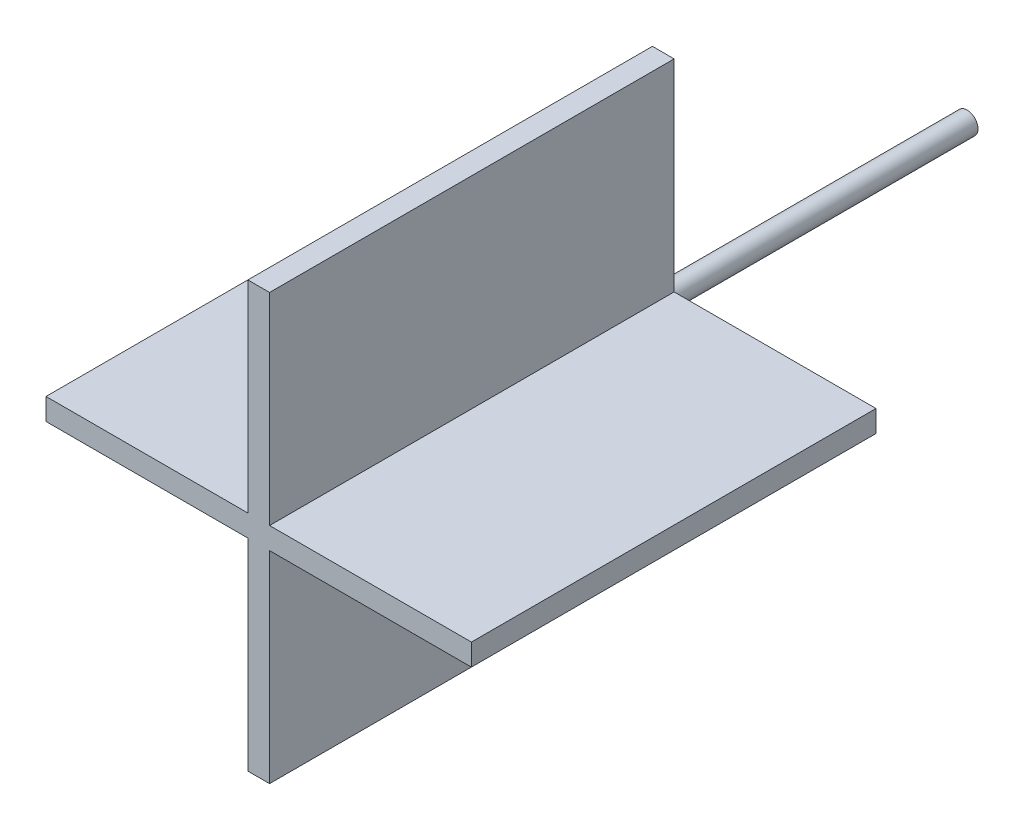
ISO-10303-21;
HEADER;
FILE_DESCRIPTION(('STEP AP214'),'2;1');
FILE_NAME('part.step','',(''),(''),'','','');
FILE_SCHEMA(('AUTOMOTIVE_DESIGN { 1 0 10303 214 1 1 1 1 }'));
ENDSEC;
DATA;
#1=APPLICATION_CONTEXT('core data for automotive mechanical design processes');
#2=APPLICATION_PROTOCOL_DEFINITION('international standard','automotive_design',2000,#1);
#3=PRODUCT_CONTEXT('',#1,'mechanical');
#4=PRODUCT('Part','Part','',(#3));
#5=PRODUCT_RELATED_PRODUCT_CATEGORY('part','',(#4));
#6=PRODUCT_DEFINITION_FORMATION('','',#4);
#7=PRODUCT_DEFINITION_CONTEXT('part definition',#1,'design');
#8=PRODUCT_DEFINITION('design','',#6,#7);
#9=PRODUCT_DEFINITION_SHAPE('','',#8);
#10=(LENGTH_UNIT() NAMED_UNIT(*) SI_UNIT(.MILLI.,.METRE.));
#11=(NAMED_UNIT(*) PLANE_ANGLE_UNIT() SI_UNIT($,.RADIAN.));
#12=(NAMED_UNIT(*) SI_UNIT($,.STERADIAN.) SOLID_ANGLE_UNIT());
#13=UNCERTAINTY_MEASURE_WITH_UNIT(LENGTH_MEASURE(1.E-05),#10,'distance_accuracy_value','');
#14=(GEOMETRIC_REPRESENTATION_CONTEXT(3) GLOBAL_UNCERTAINTY_ASSIGNED_CONTEXT((#13)) GLOBAL_UNIT_ASSIGNED_CONTEXT((#10,
#11,#12)) REPRESENTATION_CONTEXT('',''));
#15=CARTESIAN_POINT('',(0.,0.,0.));
#16=DIRECTION('',(0.,0.,1.));
#17=DIRECTION('',(1.,0.,0.));
#18=AXIS2_PLACEMENT_3D('',#15,#16,#17);
#19=CARTESIAN_POINT('',(0.,-46.5,93.2));
#20=DIRECTION('',(1.,0.,0.));
#21=DIRECTION('',(0.,1.,0.));
#22=AXIS2_PLACEMENT_3D('',#19,#20,#21);
#23=PLANE('',#22);
#24=DIRECTION('',(0.,-1.,0.));
#25=VECTOR('',#24,1.);
#26=CARTESIAN_POINT('',(0.,-46.5,0.));
#27=LINE('',#26,#25);
#28=CARTESIAN_POINT('',(0.,0.,0.));
#29=VERTEX_POINT('',#28);
#30=CARTESIAN_POINT('',(0.,-46.5,0.));
#31=VERTEX_POINT('',#30);
#32=EDGE_CURVE('E159',#29,#31,#27,.T.);
#33=ORIENTED_EDGE('',*,*,#32,.T.);
#34=DIRECTION('',(0.,0.,-1.));
#35=VECTOR('',#34,1.);
#36=CARTESIAN_POINT('',(0.,-46.5,93.2));
#37=LINE('',#36,#35);
#38=CARTESIAN_POINT('',(0.,-46.5,93.2));
#39=VERTEX_POINT('',#38);
#40=EDGE_CURVE('E11',#39,#31,#37,.T.);
#41=ORIENTED_EDGE('',*,*,#40,.F.);
#42=DIRECTION('',(0.,-1.,0.));
#43=VECTOR('',#42,1.);
#44=CARTESIAN_POINT('',(0.,-46.5,93.2));
#45=LINE('',#44,#43);
#46=CARTESIAN_POINT('',(0.,0.,93.2));
#47=VERTEX_POINT('',#46);
#48=EDGE_CURVE('E182',#47,#39,#45,.T.);
#49=ORIENTED_EDGE('',*,*,#48,.F.);
#50=DIRECTION('',(0.,0.,-1.));
#51=VECTOR('',#50,1.);
#52=CARTESIAN_POINT('',(0.,0.,93.2));
#53=LINE('',#52,#51);
#54=EDGE_CURVE('E155',#47,#29,#53,.T.);
#55=ORIENTED_EDGE('',*,*,#54,.T.);
#56=EDGE_LOOP('',(#33,#41,#49,#55));
#57=FACE_BOUND('',#56,.T.);
#58=ADVANCED_FACE('F39',(#57),#23,.F.);
#59=CARTESIAN_POINT('',(5.00000000000001,-46.5,93.2));
#60=DIRECTION('',(0.,1.,0.));
#61=DIRECTION('',(0.,0.,1.));
#62=AXIS2_PLACEMENT_3D('',#59,#60,#61);
#63=PLANE('',#62);
#64=DIRECTION('',(1.,0.,0.));
#65=VECTOR('',#64,1.);
#66=CARTESIAN_POINT('',(5.00000000000001,-46.5,0.));
#67=LINE('',#66,#65);
#68=CARTESIAN_POINT('',(5.00000000000001,-46.5,0.));
#69=VERTEX_POINT('',#68);
#70=EDGE_CURVE('E162',#31,#69,#67,.T.);
#71=ORIENTED_EDGE('',*,*,#70,.T.);
#72=DIRECTION('',(0.,0.,-1.));
#73=VECTOR('',#72,1.);
#74=CARTESIAN_POINT('',(5.00000000000001,-46.5,93.2));
#75=LINE('',#74,#73);
#76=CARTESIAN_POINT('',(5.00000000000001,-46.5,93.2));
#77=VERTEX_POINT('',#76);
#78=EDGE_CURVE('E47',#77,#69,#75,.T.);
#79=ORIENTED_EDGE('',*,*,#78,.F.);
#80=DIRECTION('',(1.,0.,0.));
#81=VECTOR('',#80,1.);
#82=CARTESIAN_POINT('',(5.00000000000001,-46.5,93.2));
#83=LINE('',#82,#81);
#84=EDGE_CURVE('E110',#39,#77,#83,.T.);
#85=ORIENTED_EDGE('',*,*,#84,.F.);
#86=ORIENTED_EDGE('',*,*,#40,.T.);
#87=EDGE_LOOP('',(#71,#79,#85,#86));
#88=FACE_BOUND('',#87,.T.);
#89=ADVANCED_FACE('F260',(#88),#63,.F.);
#90=CARTESIAN_POINT('',(4.99999999999988,-2.22044604925031E-13,93.2));
#91=DIRECTION('',(-1.,0.,0.));
#92=DIRECTION('',(0.,-1.,0.));
#93=AXIS2_PLACEMENT_3D('',#90,#91,#92);
#94=PLANE('',#93);
#95=DIRECTION('',(0.,1.,0.));
#96=VECTOR('',#95,1.);
#97=CARTESIAN_POINT('',(4.99999999999988,-2.22044604925031E-13,0.));
#98=LINE('',#97,#96);
#99=CARTESIAN_POINT('',(4.99999999999988,-2.22044604925031E-13,0.));
#100=VERTEX_POINT('',#99);
#101=EDGE_CURVE('E165',#69,#100,#98,.T.);
#102=ORIENTED_EDGE('',*,*,#101,.T.);
#103=DIRECTION('',(0.,0.,-1.));
#104=VECTOR('',#103,1.);
#105=CARTESIAN_POINT('',(4.99999999999988,-2.22044604925031E-13,93.2));
#106=LINE('',#105,#104);
#107=CARTESIAN_POINT('',(4.99999999999988,-2.22044604925031E-13,93.2));
#108=VERTEX_POINT('',#107);
#109=EDGE_CURVE('E201',#108,#100,#106,.T.);
#110=ORIENTED_EDGE('',*,*,#109,.F.);
#111=DIRECTION('',(0.,1.,0.));
#112=VECTOR('',#111,1.);
#113=CARTESIAN_POINT('',(4.99999999999988,-2.22044604925031E-13,93.2));
#114=LINE('',#113,#112);
#115=EDGE_CURVE('E209',#77,#108,#114,.T.);
#116=ORIENTED_EDGE('',*,*,#115,.F.);
#117=ORIENTED_EDGE('',*,*,#78,.T.);
#118=EDGE_LOOP('',(#102,#110,#116,#117));
#119=FACE_BOUND('',#118,.T.);
#120=ADVANCED_FACE('F207',(#119),#94,.F.);
#121=CARTESIAN_POINT('',(51.4999999999999,-2.16349997308996E-13,93.2));
#122=DIRECTION('',(0.,1.,0.));
#123=DIRECTION('',(-1.,0.,0.));
#124=AXIS2_PLACEMENT_3D('',#121,#122,#123);
#125=PLANE('',#124);
#126=DIRECTION('',(1.,0.,0.));
#127=VECTOR('',#126,1.);
#128=CARTESIAN_POINT('',(51.4999999999999,-2.16349997308996E-13,0.));
#129=LINE('',#128,#127);
#130=CARTESIAN_POINT('',(51.4999999999999,-2.16349997308996E-13,0.));
#131=VERTEX_POINT('',#130);
#132=EDGE_CURVE('E167',#100,#131,#129,.T.);
#133=ORIENTED_EDGE('',*,*,#132,.T.);
#134=DIRECTION('',(0.,0.,-1.));
#135=VECTOR('',#134,1.);
#136=CARTESIAN_POINT('',(51.4999999999999,-2.16349997308996E-13,93.2));
#137=LINE('',#136,#135);
#138=CARTESIAN_POINT('',(51.4999999999999,-2.16349997308996E-13,93.2));
#139=VERTEX_POINT('',#138);
#140=EDGE_CURVE('E198',#139,#131,#137,.T.);
#141=ORIENTED_EDGE('',*,*,#140,.F.);
#142=DIRECTION('',(1.,0.,0.));
#143=VECTOR('',#142,1.);
#144=CARTESIAN_POINT('',(51.4999999999999,-2.16349997308996E-13,93.2));
#145=LINE('',#144,#143);
#146=EDGE_CURVE('E227',#108,#139,#145,.T.);
#147=ORIENTED_EDGE('',*,*,#146,.F.);
#148=ORIENTED_EDGE('',*,*,#109,.T.);
#149=EDGE_LOOP('',(#133,#141,#147,#148));
#150=FACE_BOUND('',#149,.T.);
#151=ADVANCED_FACE('F218',(#150),#125,.F.);
#152=CARTESIAN_POINT('',(51.4999999999999,4.99999999999978,93.2));
#153=DIRECTION('',(-1.,0.,0.));
#154=DIRECTION('',(0.,0.,1.));
#155=AXIS2_PLACEMENT_3D('',#152,#153,#154);
#156=PLANE('',#155);
#157=DIRECTION('',(0.,1.,0.));
#158=VECTOR('',#157,1.);
#159=CARTESIAN_POINT('',(51.4999999999999,4.99999999999978,0.));
#160=LINE('',#159,#158);
#161=CARTESIAN_POINT('',(51.4999999999999,4.99999999999978,0.));
#162=VERTEX_POINT('',#161);
#163=EDGE_CURVE('E169',#131,#162,#160,.T.);
#164=ORIENTED_EDGE('',*,*,#163,.T.);
#165=DIRECTION('',(0.,0.,-1.));
#166=VECTOR('',#165,1.);
#167=CARTESIAN_POINT('',(51.4999999999999,4.99999999999978,93.2));
#168=LINE('',#167,#166);
#169=CARTESIAN_POINT('',(51.4999999999999,4.99999999999978,93.2));
#170=VERTEX_POINT('',#169);
#171=EDGE_CURVE('E195',#170,#162,#168,.T.);
#172=ORIENTED_EDGE('',*,*,#171,.F.);
#173=DIRECTION('',(0.,1.,0.));
#174=VECTOR('',#173,1.);
#175=CARTESIAN_POINT('',(51.4999999999999,4.99999999999978,93.2));
#176=LINE('',#175,#174);
#177=EDGE_CURVE('E224',#139,#170,#176,.T.);
#178=ORIENTED_EDGE('',*,*,#177,.F.);
#179=ORIENTED_EDGE('',*,*,#140,.T.);
#180=EDGE_LOOP('',(#164,#172,#178,#179));
#181=FACE_BOUND('',#180,.T.);
#182=ADVANCED_FACE('F222',(#181),#156,.F.);
#183=CARTESIAN_POINT('',(5.00000000000002,4.99999999999992,93.2));
#184=DIRECTION('',(0.,-1.,0.));
#185=DIRECTION('',(1.,0.,0.));
#186=AXIS2_PLACEMENT_3D('',#183,#184,#185);
#187=PLANE('',#186);
#188=DIRECTION('',(-1.,0.,0.));
#189=VECTOR('',#188,1.);
#190=CARTESIAN_POINT('',(5.00000000000002,4.99999999999992,0.));
#191=LINE('',#190,#189);
#192=CARTESIAN_POINT('',(5.00000000000002,4.99999999999992,0.));
#193=VERTEX_POINT('',#192);
#194=EDGE_CURVE('E171',#162,#193,#191,.T.);
#195=ORIENTED_EDGE('',*,*,#194,.T.);
#196=DIRECTION('',(0.,0.,-1.));
#197=VECTOR('',#196,1.);
#198=CARTESIAN_POINT('',(5.00000000000002,4.99999999999992,93.2));
#199=LINE('',#198,#197);
#200=CARTESIAN_POINT('',(5.00000000000002,4.99999999999992,93.2));
#201=VERTEX_POINT('',#200);
#202=EDGE_CURVE('E192',#201,#193,#199,.T.);
#203=ORIENTED_EDGE('',*,*,#202,.F.);
#204=DIRECTION('',(-1.,0.,0.));
#205=VECTOR('',#204,1.);
#206=CARTESIAN_POINT('',(5.00000000000002,4.99999999999992,93.2));
#207=LINE('',#206,#205);
#208=EDGE_CURVE('E226',#170,#201,#207,.T.);
#209=ORIENTED_EDGE('',*,*,#208,.F.);
#210=ORIENTED_EDGE('',*,*,#171,.T.);
#211=EDGE_LOOP('',(#195,#203,#209,#210));
#212=FACE_BOUND('',#211,.T.);
#213=ADVANCED_FACE('F273',(#212),#187,.F.);
#214=CARTESIAN_POINT('',(5.,51.4999999999999,93.2));
#215=DIRECTION('',(-1.,0.,0.));
#216=DIRECTION('',(0.,-1.,0.));
#217=AXIS2_PLACEMENT_3D('',#214,#215,#216);
#218=PLANE('',#217);
#219=DIRECTION('',(0.,1.,0.));
#220=VECTOR('',#219,1.);
#221=CARTESIAN_POINT('',(5.,51.4999999999999,0.));
#222=LINE('',#221,#220);
#223=CARTESIAN_POINT('',(5.,51.4999999999999,0.));
#224=VERTEX_POINT('',#223);
#225=EDGE_CURVE('E173',#193,#224,#222,.T.);
#226=ORIENTED_EDGE('',*,*,#225,.T.);
#227=DIRECTION('',(0.,0.,-1.));
#228=VECTOR('',#227,1.);
#229=CARTESIAN_POINT('',(5.,51.4999999999999,93.2));
#230=LINE('',#229,#228);
#231=CARTESIAN_POINT('',(5.,51.4999999999999,93.2));
#232=VERTEX_POINT('',#231);
#233=EDGE_CURVE('E189',#232,#224,#230,.T.);
#234=ORIENTED_EDGE('',*,*,#233,.F.);
#235=DIRECTION('',(0.,1.,0.));
#236=VECTOR('',#235,1.);
#237=CARTESIAN_POINT('',(5.,51.4999999999999,93.2));
#238=LINE('',#237,#236);
#239=EDGE_CURVE('E229',#201,#232,#238,.T.);
#240=ORIENTED_EDGE('',*,*,#239,.F.);
#241=ORIENTED_EDGE('',*,*,#202,.T.);
#242=EDGE_LOOP('',(#226,#234,#240,#241));
#243=FACE_BOUND('',#242,.T.);
#244=ADVANCED_FACE('F276',(#243),#218,.F.);
#245=CARTESIAN_POINT('',(0.,51.4999999999999,93.2));
#246=DIRECTION('',(0.,-1.,0.));
#247=DIRECTION('',(0.,0.,-1.));
#248=AXIS2_PLACEMENT_3D('',#245,#246,#247);
#249=PLANE('',#248);
#250=DIRECTION('',(-1.,0.,0.));
#251=VECTOR('',#250,1.);
#252=CARTESIAN_POINT('',(0.,51.4999999999999,0.));
#253=LINE('',#252,#251);
#254=CARTESIAN_POINT('',(0.,51.4999999999999,0.));
#255=VERTEX_POINT('',#254);
#256=EDGE_CURVE('E175',#224,#255,#253,.T.);
#257=ORIENTED_EDGE('',*,*,#256,.T.);
#258=DIRECTION('',(0.,0.,-1.));
#259=VECTOR('',#258,1.);
#260=CARTESIAN_POINT('',(0.,51.4999999999999,93.2));
#261=LINE('',#260,#259);
#262=CARTESIAN_POINT('',(0.,51.4999999999999,93.2));
#263=VERTEX_POINT('',#262);
#264=EDGE_CURVE('E186',#263,#255,#261,.T.);
#265=ORIENTED_EDGE('',*,*,#264,.F.);
#266=DIRECTION('',(-1.,0.,0.));
#267=VECTOR('',#266,1.);
#268=CARTESIAN_POINT('',(0.,51.4999999999999,93.2));
#269=LINE('',#268,#267);
#270=EDGE_CURVE('E235',#232,#263,#269,.T.);
#271=ORIENTED_EDGE('',*,*,#270,.F.);
#272=ORIENTED_EDGE('',*,*,#233,.T.);
#273=EDGE_LOOP('',(#257,#265,#271,#272));
#274=FACE_BOUND('',#273,.T.);
#275=ADVANCED_FACE('F241',(#274),#249,.F.);
#276=CARTESIAN_POINT('',(0.,4.99999999999999,93.2));
#277=DIRECTION('',(1.,0.,0.));
#278=DIRECTION('',(0.,1.,0.));
#279=AXIS2_PLACEMENT_3D('',#276,#277,#278);
#280=PLANE('',#279);
#281=DIRECTION('',(0.,-1.,0.));
#282=VECTOR('',#281,1.);
#283=CARTESIAN_POINT('',(0.,4.99999999999999,0.));
#284=LINE('',#283,#282);
#285=CARTESIAN_POINT('',(0.,4.99999999999999,0.));
#286=VERTEX_POINT('',#285);
#287=EDGE_CURVE('E177',#255,#286,#284,.T.);
#288=ORIENTED_EDGE('',*,*,#287,.T.);
#289=DIRECTION('',(0.,0.,-1.));
#290=VECTOR('',#289,1.);
#291=CARTESIAN_POINT('',(0.,4.99999999999999,93.2));
#292=LINE('',#291,#290);
#293=CARTESIAN_POINT('',(0.,4.99999999999999,93.2));
#294=VERTEX_POINT('',#293);
#295=EDGE_CURVE('E150',#294,#286,#292,.T.);
#296=ORIENTED_EDGE('',*,*,#295,.F.);
#297=DIRECTION('',(0.,-1.,0.));
#298=VECTOR('',#297,1.);
#299=CARTESIAN_POINT('',(0.,4.99999999999999,93.2));
#300=LINE('',#299,#298);
#301=EDGE_CURVE('E141',#263,#294,#300,.T.);
#302=ORIENTED_EDGE('',*,*,#301,.F.);
#303=ORIENTED_EDGE('',*,*,#264,.T.);
#304=EDGE_LOOP('',(#288,#296,#302,#303));
#305=FACE_BOUND('',#304,.T.);
#306=ADVANCED_FACE('F245',(#305),#280,.F.);
#307=CARTESIAN_POINT('',(-46.5,4.99999999999999,93.2));
#308=DIRECTION('',(0.,-1.,0.));
#309=DIRECTION('',(0.,0.,-1.));
#310=AXIS2_PLACEMENT_3D('',#307,#308,#309);
#311=PLANE('',#310);
#312=DIRECTION('',(-1.,0.,0.));
#313=VECTOR('',#312,1.);
#314=CARTESIAN_POINT('',(-46.5,4.99999999999999,0.));
#315=LINE('',#314,#313);
#316=CARTESIAN_POINT('',(-46.5,4.99999999999999,0.));
#317=VERTEX_POINT('',#316);
#318=EDGE_CURVE('E149',#286,#317,#315,.T.);
#319=ORIENTED_EDGE('',*,*,#318,.T.);
#320=DIRECTION('',(0.,0.,-1.));
#321=VECTOR('',#320,1.);
#322=CARTESIAN_POINT('',(-46.5,4.99999999999999,93.2));
#323=LINE('',#322,#321);
#324=CARTESIAN_POINT('',(-46.5,4.99999999999999,93.2));
#325=VERTEX_POINT('',#324);
#326=EDGE_CURVE('E146',#325,#317,#323,.T.);
#327=ORIENTED_EDGE('',*,*,#326,.F.);
#328=DIRECTION('',(-1.,0.,0.));
#329=VECTOR('',#328,1.);
#330=CARTESIAN_POINT('',(-46.5,4.99999999999999,93.2));
#331=LINE('',#330,#329);
#332=EDGE_CURVE('E135',#294,#325,#331,.T.);
#333=ORIENTED_EDGE('',*,*,#332,.F.);
#334=ORIENTED_EDGE('',*,*,#295,.T.);
#335=EDGE_LOOP('',(#319,#327,#333,#334));
#336=FACE_BOUND('',#335,.T.);
#337=ADVANCED_FACE('F147',(#336),#311,.F.);
#338=CARTESIAN_POINT('',(-46.5,0.,93.2));
#339=DIRECTION('',(1.,0.,0.));
#340=DIRECTION('',(0.,1.,0.));
#341=AXIS2_PLACEMENT_3D('',#338,#339,#340);
#342=PLANE('',#341);
#343=DIRECTION('',(0.,-1.,0.));
#344=VECTOR('',#343,1.);
#345=CARTESIAN_POINT('',(-46.5,0.,0.));
#346=LINE('',#345,#344);
#347=CARTESIAN_POINT('',(-46.5,0.,0.));
#348=VERTEX_POINT('',#347);
#349=EDGE_CURVE('E96',#317,#348,#346,.T.);
#350=ORIENTED_EDGE('',*,*,#349,.T.);
#351=DIRECTION('',(0.,0.,-1.));
#352=VECTOR('',#351,1.);
#353=CARTESIAN_POINT('',(-46.5,0.,93.2));
#354=LINE('',#353,#352);
#355=CARTESIAN_POINT('',(-46.5,0.,93.2));
#356=VERTEX_POINT('',#355);
#357=EDGE_CURVE('E151',#356,#348,#354,.T.);
#358=ORIENTED_EDGE('',*,*,#357,.F.);
#359=DIRECTION('',(0.,-1.,0.));
#360=VECTOR('',#359,1.);
#361=CARTESIAN_POINT('',(-46.5,0.,93.2));
#362=LINE('',#361,#360);
#363=EDGE_CURVE('E139',#325,#356,#362,.T.);
#364=ORIENTED_EDGE('',*,*,#363,.F.);
#365=ORIENTED_EDGE('',*,*,#326,.T.);
#366=EDGE_LOOP('',(#350,#358,#364,#365));
#367=FACE_BOUND('',#366,.T.);
#368=ADVANCED_FACE('F153',(#367),#342,.F.);
#369=CARTESIAN_POINT('',(0.,0.,93.2));
#370=DIRECTION('',(0.,1.,0.));
#371=DIRECTION('',(-1.,0.,0.));
#372=AXIS2_PLACEMENT_3D('',#369,#370,#371);
#373=PLANE('',#372);
#374=DIRECTION('',(1.,0.,0.));
#375=VECTOR('',#374,1.);
#376=CARTESIAN_POINT('',(0.,0.,0.));
#377=LINE('',#376,#375);
#378=EDGE_CURVE('E102',#348,#29,#377,.T.);
#379=ORIENTED_EDGE('',*,*,#378,.T.);
#380=ORIENTED_EDGE('',*,*,#54,.F.);
#381=DIRECTION('',(1.,0.,0.));
#382=VECTOR('',#381,1.);
#383=CARTESIAN_POINT('',(0.,0.,93.2));
#384=LINE('',#383,#382);
#385=EDGE_CURVE('E55',#356,#47,#384,.T.);
#386=ORIENTED_EDGE('',*,*,#385,.F.);
#387=ORIENTED_EDGE('',*,*,#357,.T.);
#388=EDGE_LOOP('',(#379,#380,#386,#387));
#389=FACE_BOUND('',#388,.T.);
#390=ADVANCED_FACE('F249',(#389),#373,.F.);
#391=CARTESIAN_POINT('',(0.,0.,93.2));
#392=DIRECTION('',(0.,0.,1.));
#393=DIRECTION('',(1.,0.,0.));
#394=AXIS2_PLACEMENT_3D('',#391,#392,#393);
#395=PLANE('',#394);
#396=ORIENTED_EDGE('',*,*,#48,.T.);
#397=ORIENTED_EDGE('',*,*,#84,.T.);
#398=ORIENTED_EDGE('',*,*,#115,.T.);
#399=ORIENTED_EDGE('',*,*,#146,.T.);
#400=ORIENTED_EDGE('',*,*,#177,.T.);
#401=ORIENTED_EDGE('',*,*,#208,.T.);
#402=ORIENTED_EDGE('',*,*,#239,.T.);
#403=ORIENTED_EDGE('',*,*,#270,.T.);
#404=ORIENTED_EDGE('',*,*,#301,.T.);
#405=ORIENTED_EDGE('',*,*,#332,.T.);
#406=ORIENTED_EDGE('',*,*,#363,.T.);
#407=ORIENTED_EDGE('',*,*,#385,.T.);
#408=EDGE_LOOP('',(#396,#397,#398,#399,#400,#401,#402,#403,#404,#405,#406,#407));
#409=FACE_BOUND('',#408,.T.);
#410=ADVANCED_FACE('F137',(#409),#395,.T.);
#411=CARTESIAN_POINT('',(0.,0.,0.));
#412=DIRECTION('',(0.,0.,1.));
#413=DIRECTION('',(1.,0.,0.));
#414=AXIS2_PLACEMENT_3D('',#411,#412,#413);
#415=PLANE('',#414);
#416=CARTESIAN_POINT('',(2.5,2.53696306111983,0.));
#417=DIRECTION('',(0.,0.,1.));
#418=DIRECTION('',(1.,0.,0.));
#419=AXIS2_PLACEMENT_3D('',#416,#417,#418);
#420=CIRCLE('',#419,2.5);
#421=CARTESIAN_POINT('',(5.00000000000001,2.53696306111983,0.));
#422=VERTEX_POINT('',#421);
#423=EDGE_CURVE('E339',#422,#422,#420,.T.);
#424=ORIENTED_EDGE('',*,*,#423,.T.);
#425=EDGE_LOOP('',(#424));
#426=FACE_BOUND('',#425,.T.);
#427=ORIENTED_EDGE('',*,*,#32,.F.);
#428=ORIENTED_EDGE('',*,*,#378,.F.);
#429=ORIENTED_EDGE('',*,*,#349,.F.);
#430=ORIENTED_EDGE('',*,*,#318,.F.);
#431=ORIENTED_EDGE('',*,*,#287,.F.);
#432=ORIENTED_EDGE('',*,*,#256,.F.);
#433=ORIENTED_EDGE('',*,*,#225,.F.);
#434=ORIENTED_EDGE('',*,*,#194,.F.);
#435=ORIENTED_EDGE('',*,*,#163,.F.);
#436=ORIENTED_EDGE('',*,*,#132,.F.);
#437=ORIENTED_EDGE('',*,*,#101,.F.);
#438=ORIENTED_EDGE('',*,*,#70,.F.);
#439=EDGE_LOOP('',(#427,#428,#429,#430,#431,#432,#433,#434,#435,#436,#437,#438));
#440=FACE_BOUND('',#439,.T.);
#441=ADVANCED_FACE('F213',(#426,#440),#415,.F.);
#442=CARTESIAN_POINT('',(2.5,2.53696306111983,-70.));
#443=DIRECTION('',(0.,0.,1.));
#444=DIRECTION('',(1.,0.,0.));
#445=AXIS2_PLACEMENT_3D('',#442,#443,#444);
#446=CYLINDRICAL_SURFACE('',#445,2.5);
#447=CARTESIAN_POINT('',(2.5,2.53696306111983,-70.));
#448=DIRECTION('',(0.,0.,1.));
#449=DIRECTION('',(1.,0.,0.));
#450=AXIS2_PLACEMENT_3D('',#447,#448,#449);
#451=CIRCLE('',#450,2.5);
#452=CARTESIAN_POINT('',(5.00000000000001,2.53696306111983,-70.));
#453=VERTEX_POINT('',#452);
#454=EDGE_CURVE('E163',#453,#453,#451,.T.);
#455=ORIENTED_EDGE('',*,*,#454,.T.);
#456=EDGE_LOOP('',(#455));
#457=FACE_BOUND('',#456,.T.);
#458=ORIENTED_EDGE('',*,*,#423,.F.);
#459=EDGE_LOOP('',(#458));
#460=FACE_BOUND('',#459,.T.);
#461=ADVANCED_FACE('F315',(#457,#460),#446,.T.);
#462=CARTESIAN_POINT('',(2.5,2.53696306111983,-70.));
#463=DIRECTION('',(0.,0.,1.));
#464=DIRECTION('',(1.,0.,0.));
#465=AXIS2_PLACEMENT_3D('',#462,#463,#464);
#466=PLANE('',#465);
#467=ORIENTED_EDGE('',*,*,#454,.F.);
#468=EDGE_LOOP('',(#467));
#469=FACE_BOUND('',#468,.T.);
#470=ADVANCED_FACE('F324',(#469),#466,.F.);
#471=CLOSED_SHELL('',(#58,#89,#120,#151,#182,#213,#244,#275,#306,#337,#368,#390,#410,#441,#461,#470));
#472=MANIFOLD_SOLID_BREP('B2',#471);
#473=ADVANCED_BREP_SHAPE_REPRESENTATION('',(#18,#472),#14);
#474=SHAPE_DEFINITION_REPRESENTATION(#9,#473);
ENDSEC;
END-ISO-10303-21;
